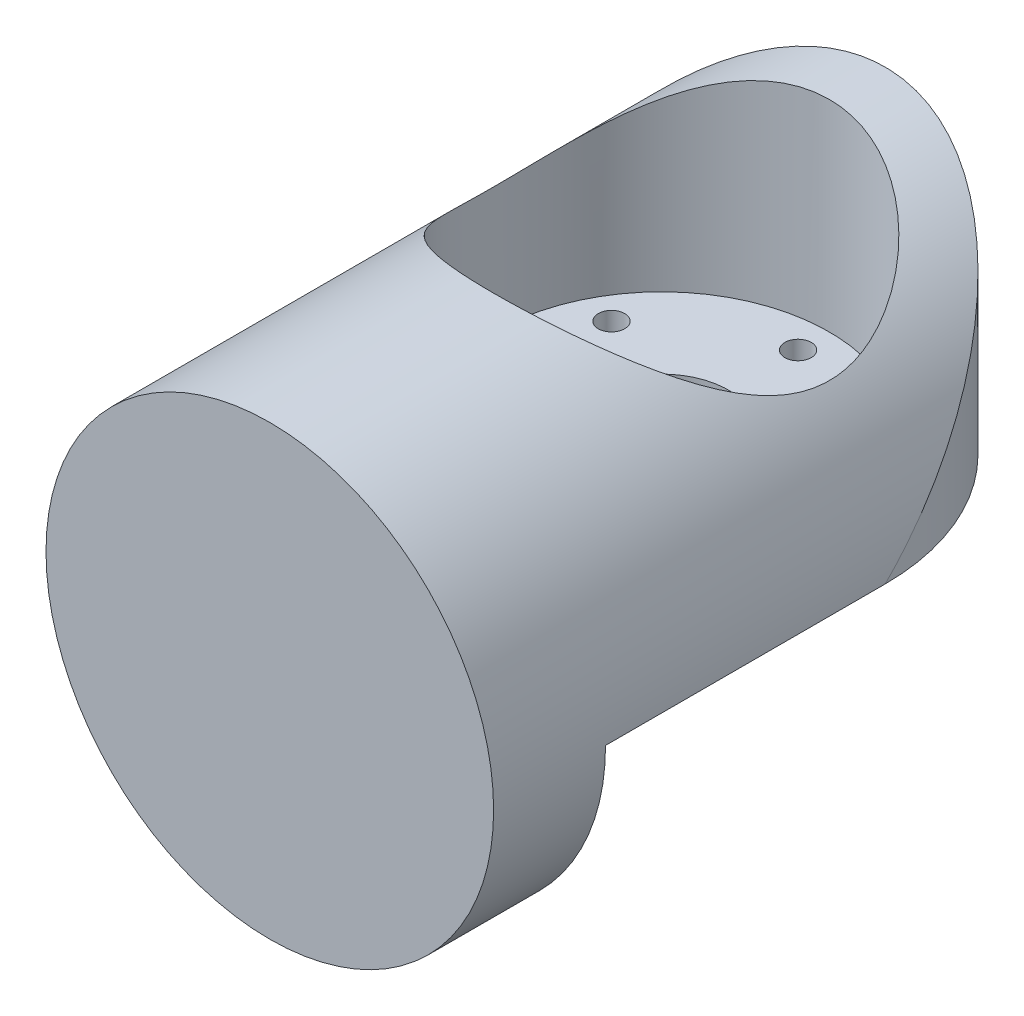
ISO-10303-21;
HEADER;
FILE_DESCRIPTION(('STEP AP214'),'2;1');
FILE_NAME('part.step','',(''),(''),'','','');
FILE_SCHEMA(('AUTOMOTIVE_DESIGN { 1 0 10303 214 1 1 1 1 }'));
ENDSEC;
DATA;
#1=APPLICATION_CONTEXT('core data for automotive mechanical design processes');
#2=APPLICATION_PROTOCOL_DEFINITION('international standard','automotive_design',2000,#1);
#3=PRODUCT_CONTEXT('',#1,'mechanical');
#4=PRODUCT('Part','Part','',(#3));
#5=PRODUCT_RELATED_PRODUCT_CATEGORY('part','',(#4));
#6=PRODUCT_DEFINITION_FORMATION('','',#4);
#7=PRODUCT_DEFINITION_CONTEXT('part definition',#1,'design');
#8=PRODUCT_DEFINITION('design','',#6,#7);
#9=PRODUCT_DEFINITION_SHAPE('','',#8);
#10=(LENGTH_UNIT() NAMED_UNIT(*) SI_UNIT(.MILLI.,.METRE.));
#11=(NAMED_UNIT(*) PLANE_ANGLE_UNIT() SI_UNIT($,.RADIAN.));
#12=(NAMED_UNIT(*) SI_UNIT($,.STERADIAN.) SOLID_ANGLE_UNIT());
#13=UNCERTAINTY_MEASURE_WITH_UNIT(LENGTH_MEASURE(1.E-05),#10,'distance_accuracy_value','');
#14=(GEOMETRIC_REPRESENTATION_CONTEXT(3) GLOBAL_UNCERTAINTY_ASSIGNED_CONTEXT((#13)) GLOBAL_UNIT_ASSIGNED_CONTEXT((#10,
#11,#12)) REPRESENTATION_CONTEXT('',''));
#15=CARTESIAN_POINT('',(0.,0.,0.));
#16=DIRECTION('',(0.,0.,1.));
#17=DIRECTION('',(1.,0.,0.));
#18=AXIS2_PLACEMENT_3D('',#15,#16,#17);
#19=CARTESIAN_POINT('',(0.,25.4,-31.75));
#20=DIRECTION('',(0.,-1.,0.));
#21=DIRECTION('',(0.,0.,-1.));
#22=AXIS2_PLACEMENT_3D('',#19,#20,#21);
#23=CYLINDRICAL_SURFACE('',#22,25.4);
#24=CARTESIAN_POINT('',(0.,0.,-31.75));
#25=DIRECTION('',(0.,-0.707106781186547,-0.707106781186547));
#26=DIRECTION('',(0.,-0.707106781186547,0.707106781186547));
#27=AXIS2_PLACEMENT_3D('',#24,#25,#26);
#28=ELLIPSE('',#27,35.9210244842766,25.4);
#29=CARTESIAN_POINT('',(25.4,0.,-31.75));
#30=VERTEX_POINT('',#29);
#31=CARTESIAN_POINT('',(-25.4,0.,-31.75));
#32=VERTEX_POINT('',#31);
#33=EDGE_CURVE('E96',#30,#32,#28,.F.);
#34=ORIENTED_EDGE('',*,*,#33,.F.);
#35=CARTESIAN_POINT('',(0.,0.,-31.75));
#36=DIRECTION('',(0.,1.,0.));
#37=DIRECTION('',(0.,0.,1.));
#38=AXIS2_PLACEMENT_3D('',#35,#36,#37);
#39=CIRCLE('',#38,25.4);
#40=EDGE_CURVE('E103',#30,#32,#39,.T.);
#41=ORIENTED_EDGE('',*,*,#40,.T.);
#42=EDGE_LOOP('',(#34,#41));
#43=FACE_BOUND('',#42,.T.);
#44=ADVANCED_FACE('F73',(#43),#23,.T.);
#45=CARTESIAN_POINT('',(0.,-53.8815367264149,-31.75));
#46=DIRECTION('',(0.,1.,0.));
#47=DIRECTION('',(0.,0.,1.));
#48=AXIS2_PLACEMENT_3D('',#45,#46,#47);
#49=CYLINDRICAL_SURFACE('',#48,19.05);
#50=CARTESIAN_POINT('',(0.,2.54,-31.75));
#51=DIRECTION('',(0.,1.,0.));
#52=DIRECTION('',(0.,0.,1.));
#53=AXIS2_PLACEMENT_3D('',#50,#51,#52);
#54=CIRCLE('',#53,19.05);
#55=CARTESIAN_POINT('',(0.,2.54,-12.7));
#56=VERTEX_POINT('',#55);
#57=EDGE_CURVE('E104',#56,#56,#54,.T.);
#58=ORIENTED_EDGE('',*,*,#57,.F.);
#59=EDGE_LOOP('',(#58));
#60=FACE_BOUND('',#59,.T.);
#61=CARTESIAN_POINT('',(0.,25.4,-50.8));
#62=CARTESIAN_POINT('',(-0.465674960815866,25.3999963833165,-50.7999962148051));
#63=CARTESIAN_POINT('',(-0.931414983833283,25.3871642978131,-50.7828960688114));
#64=CARTESIAN_POINT('',(-1.85904817792387,25.3361372053949,-50.7147790624438));
#65=CARTESIAN_POINT('',(-2.32094060418442,25.297937398281,-50.6637557829737));
#66=CARTESIAN_POINT('',(-3.23752475206199,25.1970471351016,-50.5285970624894));
#67=CARTESIAN_POINT('',(-3.6922101154738,25.1343361837591,-50.4444339107497));
#68=CARTESIAN_POINT('',(-4.59063842897279,24.9858635363918,-50.2443334792571));
#69=CARTESIAN_POINT('',(-5.0343817163395,24.9001025518355,-50.1283971802205));
#70=CARTESIAN_POINT('',(-5.90568244828982,24.7079109330935,-49.8671505237056));
#71=CARTESIAN_POINT('',(-6.33331628615475,24.6015980996388,-49.7220073909058));
#72=CARTESIAN_POINT('',(-7.17273695881707,24.3700929651458,-49.4037771723099));
#73=CARTESIAN_POINT('',(-7.58452370813733,24.2449005622916,-49.2306899358133));
#74=CARTESIAN_POINT('',(-8.39044101768357,23.9779208195937,-48.8584774726785));
#75=CARTESIAN_POINT('',(-8.78457437975126,23.8361361261782,-48.6593563977789));
#76=CARTESIAN_POINT('',(-9.55401220058095,23.5382899099122,-48.2368446174441));
#77=CARTESIAN_POINT('',(-9.92931390736304,23.3822263097558,-48.0134503798416));
#78=CARTESIAN_POINT('',(-10.6938706856181,23.04325825402,-47.5224024561988));
#79=CARTESIAN_POINT('',(-11.0812143804871,22.8592060087562,-47.2525666762131));
#80=CARTESIAN_POINT('',(-11.8314493110386,22.4800688262363,-46.6878643746782));
#81=CARTESIAN_POINT('',(-12.1943392844704,22.2849833204206,-46.3929965627996));
#82=CARTESIAN_POINT('',(-12.8955697270762,21.8866870812892,-45.77940247007));
#83=CARTESIAN_POINT('',(-13.2338768620604,21.6834658741569,-45.460644941579));
#84=CARTESIAN_POINT('',(-13.884990514142,21.2724072078827,-44.8008391771931));
#85=CARTESIAN_POINT('',(-14.1977950143187,21.0645693852786,-44.4597891820951));
#86=CARTESIAN_POINT('',(-14.8584856315142,20.6053001518655,-43.684711297194));
#87=CARTESIAN_POINT('',(-15.2005719155807,20.3535978137022,-43.2458786067128));
#88=CARTESIAN_POINT('',(-15.8463325144244,19.8549799455356,-42.3380459857917));
#89=CARTESIAN_POINT('',(-16.1499952483675,19.6080658776109,-41.8690370241889));
#90=CARTESIAN_POINT('',(-16.7171388106315,19.1268214872942,-40.9017050283218));
#91=CARTESIAN_POINT('',(-16.9806593110902,18.8924788910393,-40.4034116196049));
#92=CARTESIAN_POINT('',(-17.3441892409843,18.5571109501454,-39.6342834390336));
#93=CARTESIAN_POINT('',(-17.4600545051695,18.4480324020434,-39.3743457053458));
#94=CARTESIAN_POINT('',(-17.6809070360257,18.2364714374993,-38.8471631156588));
#95=CARTESIAN_POINT('',(-17.7858918995299,18.1339904801603,-38.5799166617783));
#96=CARTESIAN_POINT('',(-18.0155350401361,17.9062611544944,-37.9537296342902));
#97=CARTESIAN_POINT('',(-18.1360990401934,17.7838967026555,-37.5922161985175));
#98=CARTESIAN_POINT('',(-18.3564835255813,17.5563270894,-36.8577343817571));
#99=CARTESIAN_POINT('',(-18.4563106667672,17.4511164245169,-36.4847697204922));
#100=CARTESIAN_POINT('',(-18.6338176068266,17.2614516829056,-35.7291493381238));
#101=CARTESIAN_POINT('',(-18.711538896713,17.1769587622157,-35.3465132598471));
#102=CARTESIAN_POINT('',(-18.843794602838,17.0317671094067,-34.5727488269731));
#103=CARTESIAN_POINT('',(-18.8983293064548,16.9710680823832,-34.1816205776923));
#104=CARTESIAN_POINT('',(-18.9834999575328,16.87574879586,-33.3898685915244));
#105=CARTESIAN_POINT('',(-19.0139111337357,16.841373911893,-32.9891905748165));
#106=CARTESIAN_POINT('',(-19.0492755928351,16.8013640298539,-32.1852694036412));
#107=CARTESIAN_POINT('',(-19.0542295742293,16.7957282432349,-31.7820263198583));
#108=CARTESIAN_POINT('',(-19.0385558913474,16.8134921503702,-30.97655915437));
#109=CARTESIAN_POINT('',(-19.017919811497,16.8369013959053,-30.5743354514972));
#110=CARTESIAN_POINT('',(-18.9515525868367,16.9115676948954,-29.7746066635626));
#111=CARTESIAN_POINT('',(-18.9058211863197,16.9628250321065,-29.3771016266233));
#112=CARTESIAN_POINT('',(-18.7964749746221,17.0838630153476,-28.6321173006633));
#113=CARTESIAN_POINT('',(-18.7353078217018,17.151063572039,-28.283849707037));
#114=CARTESIAN_POINT('',(-18.594676413,17.3034321734528,-27.5949773444654));
#115=CARTESIAN_POINT('',(-18.5152056195415,17.3886066371657,-27.254375361346));
#116=CARTESIAN_POINT('',(-18.250669163991,17.6674446941701,-26.245572356386));
#117=CARTESIAN_POINT('',(-18.0394890022204,17.8844118499967,-25.590437743444));
#118=CARTESIAN_POINT('',(-17.6000880671589,18.3159274737197,-24.4393605254907));
#119=CARTESIAN_POINT('',(-17.3824045203658,18.5233690864168,-23.9365279722459));
#120=CARTESIAN_POINT('',(-16.9083380785293,18.9570921178249,-22.957600419194));
#121=CARTESIAN_POINT('',(-16.6519353298344,19.1833831749268,-22.4815193092888));
#122=CARTESIAN_POINT('',(-16.1018972063657,19.6473579322635,-21.5557867396806));
#123=CARTESIAN_POINT('',(-15.8081859085802,19.8850642312209,-21.1061919901628));
#124=CARTESIAN_POINT('',(-15.1852463711559,20.364745154178,-20.2349010974896));
#125=CARTESIAN_POINT('',(-14.8560237296989,20.6067191003886,-19.8132005738124));
#126=CARTESIAN_POINT('',(-14.1541093904084,21.0952267701244,-18.9881687715716));
#127=CARTESIAN_POINT('',(-13.7805320074773,21.341721925792,-18.5855672139986));
#128=CARTESIAN_POINT('',(-12.9975370296717,21.8274223635072,-17.8119417815134));
#129=CARTESIAN_POINT('',(-12.5881156907222,22.0666268804856,-17.440921213391));
#130=CARTESIAN_POINT('',(-11.7347724683084,22.5319954361831,-16.7332009173351));
#131=CARTESIAN_POINT('',(-11.2909046080997,22.7581789629085,-16.3964492881146));
#132=CARTESIAN_POINT('',(-10.5999314019198,23.0838980302636,-15.9189440385571));
#133=CARTESIAN_POINT('',(-10.3654288824766,23.1902047865581,-15.7643890724049));
#134=CARTESIAN_POINT('',(-9.88811116426323,23.3977133422412,-15.4648173894617));
#135=CARTESIAN_POINT('',(-9.64529387757982,23.4989138433871,-15.3198030955243));
#136=CARTESIAN_POINT('',(-9.00374545193631,23.7544310645624,-14.9559257845921));
#137=CARTESIAN_POINT('',(-8.59874175861883,23.9042551949294,-14.7448562571597));
#138=CARTESIAN_POINT('',(-7.76969197563247,24.1864338945188,-14.3504292824567));
#139=CARTESIAN_POINT('',(-7.34564966445566,24.3187919097865,-14.167066367663));
#140=CARTESIAN_POINT('',(-6.48081198198039,24.5634027901583,-13.8302723419074));
#141=CARTESIAN_POINT('',(-6.04003749621509,24.6756797814644,-13.6768052927218));
#142=CARTESIAN_POINT('',(-5.14373741787417,24.8779596280749,-13.4015915201014));
#143=CARTESIAN_POINT('',(-4.68821495997001,24.967967182039,-13.2798381050763));
#144=CARTESIAN_POINT('',(-3.88360140979714,25.1037635942629,-13.0967384779387));
#145=CARTESIAN_POINT('',(-3.53710414759006,25.1549738918815,-13.0279070590665));
#146=CARTESIAN_POINT('',(-2.83898508322272,25.2432947897861,-12.9094055222721));
#147=CARTESIAN_POINT('',(-2.48736245901681,25.2804031018631,-12.8597385139752));
#148=CARTESIAN_POINT('',(-1.78062220829618,25.3399910775699,-12.7800672593716));
#149=CARTESIAN_POINT('',(-1.42550422736553,25.3624692419189,-12.7500650282865));
#150=CARTESIAN_POINT('',(-0.713603327383884,25.3924735603027,-12.7100319899793));
#151=CARTESIAN_POINT('',(-0.356820763685573,25.400002771263,-12.6999970996162));
#152=CARTESIAN_POINT('',(0.465674960815863,25.3999963833165,-12.7000037851949));
#153=CARTESIAN_POINT('',(0.931414983833277,25.3871642978131,-12.7171039311886));
#154=CARTESIAN_POINT('',(1.85904817792387,25.3361372053949,-12.7852209375562));
#155=CARTESIAN_POINT('',(2.32094060418442,25.297937398281,-12.8362442170263));
#156=CARTESIAN_POINT('',(3.23752475206199,25.1970471351016,-12.9714029375106));
#157=CARTESIAN_POINT('',(3.6922101154738,25.1343361837591,-13.0555660892503));
#158=CARTESIAN_POINT('',(4.59063842897279,24.9858635363918,-13.2556665207429));
#159=CARTESIAN_POINT('',(5.03438171633951,24.9001025518355,-13.3716028197795));
#160=CARTESIAN_POINT('',(5.90568244828982,24.7079109330935,-13.6328494762944));
#161=CARTESIAN_POINT('',(6.33331628615475,24.6015980996388,-13.7779926090942));
#162=CARTESIAN_POINT('',(7.17273695881707,24.3700929651458,-14.0962228276901));
#163=CARTESIAN_POINT('',(7.58452370813734,24.2449005622916,-14.2693100641867));
#164=CARTESIAN_POINT('',(8.39044101768357,23.9779208195937,-14.6415225273216));
#165=CARTESIAN_POINT('',(8.78457437975126,23.8361361261782,-14.8406436022211));
#166=CARTESIAN_POINT('',(9.55401220058095,23.5382899099122,-15.2631553825559));
#167=CARTESIAN_POINT('',(9.92931390736304,23.3822263097558,-15.4865496201584));
#168=CARTESIAN_POINT('',(10.6938706856181,23.04325825402,-15.9775975438012));
#169=CARTESIAN_POINT('',(11.0812143804871,22.8592060087562,-16.2474333237869));
#170=CARTESIAN_POINT('',(11.8314493110386,22.4800688262363,-16.8121356253218));
#171=CARTESIAN_POINT('',(12.1943392844704,22.2849833204206,-17.1070034372004));
#172=CARTESIAN_POINT('',(12.8955697270762,21.8866870812892,-17.72059752993));
#173=CARTESIAN_POINT('',(13.2338768620604,21.6834658741569,-18.039355058421));
#174=CARTESIAN_POINT('',(13.884990514142,21.2724072078827,-18.6991608228069));
#175=CARTESIAN_POINT('',(14.1977950143187,21.0645693852786,-19.0402108179049));
#176=CARTESIAN_POINT('',(14.8584856315142,20.6053001518654,-19.815288702806));
#177=CARTESIAN_POINT('',(15.2005719155807,20.3535978137022,-20.2541213932872));
#178=CARTESIAN_POINT('',(15.8463325144244,19.8549799455356,-21.1619540142083));
#179=CARTESIAN_POINT('',(16.1499952483675,19.6080658776109,-21.6309629758111));
#180=CARTESIAN_POINT('',(16.7171388106315,19.1268214872941,-22.5982949716782));
#181=CARTESIAN_POINT('',(16.9806593110902,18.8924788910393,-23.0965883803951));
#182=CARTESIAN_POINT('',(17.3441892409843,18.5571109501454,-23.8657165609664));
#183=CARTESIAN_POINT('',(17.4600545051695,18.4480324020434,-24.1256542946543));
#184=CARTESIAN_POINT('',(17.6809070360257,18.2364714374993,-24.6528368843412));
#185=CARTESIAN_POINT('',(17.7858918995299,18.1339904801603,-24.9200833382217));
#186=CARTESIAN_POINT('',(18.0155350401361,17.9062611544944,-25.5462703657098));
#187=CARTESIAN_POINT('',(18.1360990401934,17.7838967026555,-25.9077838014825));
#188=CARTESIAN_POINT('',(18.3564835255813,17.5563270894,-26.6422656182429));
#189=CARTESIAN_POINT('',(18.4563106667672,17.4511164245169,-27.0152302795078));
#190=CARTESIAN_POINT('',(18.6338176068266,17.2614516829056,-27.7708506618762));
#191=CARTESIAN_POINT('',(18.711538896713,17.1769587622157,-28.1534867401529));
#192=CARTESIAN_POINT('',(18.8437946028381,17.0317671094067,-28.9272511730269));
#193=CARTESIAN_POINT('',(18.8983293064548,16.9710680823832,-29.3183794223077));
#194=CARTESIAN_POINT('',(18.9834999575328,16.87574879586,-30.1101314084757));
#195=CARTESIAN_POINT('',(19.0139111337357,16.841373911893,-30.5108094251835));
#196=CARTESIAN_POINT('',(19.0492755928351,16.8013640298539,-31.3147305963588));
#197=CARTESIAN_POINT('',(19.0542295742293,16.7957282432349,-31.7179736801417));
#198=CARTESIAN_POINT('',(19.0385558913473,16.8134921503702,-32.5234408456301));
#199=CARTESIAN_POINT('',(19.017919811497,16.8369013959053,-32.9256645485028));
#200=CARTESIAN_POINT('',(18.9515525868367,16.9115676948954,-33.7253933364375));
#201=CARTESIAN_POINT('',(18.9058211863197,16.9628250321065,-34.1228983733767));
#202=CARTESIAN_POINT('',(18.7964749746221,17.0838630153476,-34.8678826993367));
#203=CARTESIAN_POINT('',(18.7353078217018,17.151063572039,-35.216150292963));
#204=CARTESIAN_POINT('',(18.594676413,17.3034321734528,-35.9050226555346));
#205=CARTESIAN_POINT('',(18.5152056195415,17.3886066371657,-36.245624638654));
#206=CARTESIAN_POINT('',(18.250669163991,17.6674446941701,-37.254427643614));
#207=CARTESIAN_POINT('',(18.0394890022204,17.8844118499967,-37.909562256556));
#208=CARTESIAN_POINT('',(17.6000880671588,18.3159274737197,-39.0606394745093));
#209=CARTESIAN_POINT('',(17.3824045203658,18.5233690864168,-39.5634720277541));
#210=CARTESIAN_POINT('',(16.9083380785292,18.9570921178249,-40.542399580806));
#211=CARTESIAN_POINT('',(16.6519353298343,19.1833831749268,-41.0184806907113));
#212=CARTESIAN_POINT('',(16.1018972063657,19.6473579322635,-41.9442132603194));
#213=CARTESIAN_POINT('',(15.8081859085802,19.8850642312209,-42.3938080098372));
#214=CARTESIAN_POINT('',(15.1852463711559,20.364745154178,-43.2650989025104));
#215=CARTESIAN_POINT('',(14.8560237296989,20.6067191003886,-43.6867994261876));
#216=CARTESIAN_POINT('',(14.1541093904084,21.0952267701244,-44.5118312284284));
#217=CARTESIAN_POINT('',(13.7805320074773,21.341721925792,-44.9144327860014));
#218=CARTESIAN_POINT('',(12.9975370296717,21.8274223635072,-45.6880582184866));
#219=CARTESIAN_POINT('',(12.5881156907221,22.0666268804857,-46.059078786609));
#220=CARTESIAN_POINT('',(11.7347724683084,22.5319954361831,-46.7667990826649));
#221=CARTESIAN_POINT('',(11.2909046080997,22.7581789629085,-47.1035507118854));
#222=CARTESIAN_POINT('',(10.5999314019197,23.0838980302636,-47.5810559614429));
#223=CARTESIAN_POINT('',(10.3654288824765,23.1902047865581,-47.7356109275951));
#224=CARTESIAN_POINT('',(9.8881111642632,23.3977133422412,-48.0351826105383));
#225=CARTESIAN_POINT('',(9.6452938775798,23.4989138433871,-48.1801969044757));
#226=CARTESIAN_POINT('',(9.00374545193629,23.7544310645624,-48.5440742154079));
#227=CARTESIAN_POINT('',(8.59874175861881,23.9042551949294,-48.7551437428403));
#228=CARTESIAN_POINT('',(7.76969197563244,24.1864338945188,-49.1495707175433));
#229=CARTESIAN_POINT('',(7.34564966445563,24.3187919097865,-49.332933632337));
#230=CARTESIAN_POINT('',(6.48081198198036,24.5634027901583,-49.6697276580926));
#231=CARTESIAN_POINT('',(6.04003749621506,24.6756797814644,-49.8231947072782));
#232=CARTESIAN_POINT('',(5.14373741787414,24.8779596280749,-50.0984084798986));
#233=CARTESIAN_POINT('',(4.68821495996999,24.967967182039,-50.2201618949238));
#234=CARTESIAN_POINT('',(3.88360140979712,25.1037635942629,-50.4032615220613));
#235=CARTESIAN_POINT('',(3.53710414759004,25.1549738918815,-50.4720929409335));
#236=CARTESIAN_POINT('',(2.8389850832227,25.2432947897861,-50.5905944777279));
#237=CARTESIAN_POINT('',(2.48736245901678,25.2804031018631,-50.6402614860248));
#238=CARTESIAN_POINT('',(1.78062220829616,25.3399910775699,-50.7199327406284));
#239=CARTESIAN_POINT('',(1.42550422736552,25.3624692419189,-50.7499349717135));
#240=CARTESIAN_POINT('',(0.713603327383874,25.3924735603027,-50.7899680100207));
#241=CARTESIAN_POINT('',(0.356820763685567,25.400002771263,-50.8000029003838));
#242=CARTESIAN_POINT('',(0.,25.4,-50.8));
#243=B_SPLINE_CURVE_WITH_KNOTS('',3,(#61,#62,#63,#64,#65,#66,#67,#68,#69,#70,#71,#72,#73,#74,
#75,#76,#77,#78,#79,#80,#81,#82,#83,#84,#85,#86,#87,#88,#89,#90,#91,#92,#93,#94,#95,#96,#97,#98,
#99,#100,#101,#102,#103,#104,#105,#106,#107,#108,#109,#110,#111,#112,#113,#114,#115,#116,#117,
#118,#119,#120,#121,#122,#123,#124,#125,#126,#127,#128,#129,#130,#131,#132,#133,#134,#135,#136,
#137,#138,#139,#140,#141,#142,#143,#144,#145,#146,#147,#148,#149,#150,#151,#152,#153,#154,#155,
#156,#157,#158,#159,#160,#161,#162,#163,#164,#165,#166,#167,#168,#169,#170,#171,#172,#173,#174,
#175,#176,#177,#178,#179,#180,#181,#182,#183,#184,#185,#186,#187,#188,#189,#190,#191,#192,#193,
#194,#195,#196,#197,#198,#199,#200,#201,#202,#203,#204,#205,#206,#207,#208,#209,#210,#211,#212,
#213,#214,#215,#216,#217,#218,#219,#220,#221,#222,#223,#224,#225,#226,#227,#228,#229,#230,#231,
#232,#233,#234,#235,#236,#237,#238,#239,#240,#241,#242),.UNSPECIFIED.,.T.,.F.,(4,2,2,2,2,2,2,2,
2,2,2,2,2,2,2,2,2,2,2,2,2,2,2,2,2,2,2,2,2,2,2,2,2,2,2,2,2,2,2,2,2,2,2,2,2,2,2,2,2,2,2,2,2,2,2,2,
2,2,2,2,2,2,2,2,2,2,2,2,2,2,2,2,2,2,2,2,2,2,2,2,2,2,2,2,2,2,2,2,2,2,4),(0.,1.3966518657921,
2.79356808792397,4.19165486515895,5.58969849363422,6.97995436895161,8.37021774207725,
9.76025967318114,11.1505041511404,12.669117635853,14.1878094483167,15.7085235870091,
17.2293578776156,19.0594345285377,20.8900614561841,22.7188672904586,23.6329124252075,
24.5471590178393,25.7469044030545,26.9462641120978,28.1433576302218,29.34043631095,
30.5485419060732,31.7566143528652,32.9650841929969,34.1735663469772,35.2522802330766,
36.3313800123467,38.489773212682,40.2453145941691,42.0017592226745,43.76183727022,
45.5216382548711,47.3257426569494,49.1300357318432,50.9315541594611,51.832188585897,
52.7330508525827,54.1735079782132,55.6136804769518,57.052110894295,58.4902375558893,
59.5603497054733,60.630635418966,61.7010307968546,62.7712072660418,64.1678591318339,
65.5647753539658,66.9628621312008,68.360905759676,69.7511616349934,71.1414250081191,
72.531466939223,73.9217114171823,75.4403249018948,76.9590167143586,78.4797308530509,
80.0005651436574,81.8306417945795,83.661268722226,85.4900745565005,86.4041196912493,
87.3183662838811,88.5181116690963,89.7174713781396,90.9145648962637,92.1116435769919,
93.319749172115,94.5278216189071,95.7362914590387,96.944773613019,98.0234874991185,
99.1025872783886,101.260980478724,103.016521860211,104.772966488716,106.533044536262,
108.292845520913,110.096949922991,111.901242997885,113.702761425503,114.603395851939,
115.504258118625,116.944715244255,118.384887742994,119.823318160337,121.261444821931,
122.331556971515,123.401842685008,124.472238062896,125.542414532084),.UNSPECIFIED.);
#244=CARTESIAN_POINT('',(0.,25.4,-50.8));
#245=VERTEX_POINT('',#244);
#246=EDGE_CURVE('E13',#245,#245,#243,.T.);
#247=ORIENTED_EDGE('',*,*,#246,.T.);
#248=EDGE_LOOP('',(#247));
#249=FACE_BOUND('',#248,.T.);
#250=ADVANCED_FACE('F125',(#60,#249),#49,.F.);
#251=CARTESIAN_POINT('',(0.,0.,12.7));
#252=DIRECTION('',(0.,0.,-1.));
#253=DIRECTION('',(-1.,0.,0.));
#254=AXIS2_PLACEMENT_3D('',#251,#252,#253);
#255=CYLINDRICAL_SURFACE('',#254,25.4);
#256=ORIENTED_EDGE('',*,*,#246,.F.);
#257=EDGE_LOOP('',(#256));
#258=FACE_BOUND('',#257,.T.);
#259=CARTESIAN_POINT('',(0.,0.,12.7));
#260=DIRECTION('',(0.,0.,1.));
#261=DIRECTION('',(1.,0.,0.));
#262=AXIS2_PLACEMENT_3D('',#259,#260,#261);
#263=CIRCLE('',#262,25.4);
#264=CARTESIAN_POINT('',(25.4,0.,12.7));
#265=VERTEX_POINT('',#264);
#266=EDGE_CURVE('E82',#265,#265,#263,.T.);
#267=ORIENTED_EDGE('',*,*,#266,.F.);
#268=EDGE_LOOP('',(#267));
#269=FACE_BOUND('',#268,.T.);
#270=CARTESIAN_POINT('',(0.,0.,0.));
#271=DIRECTION('',(0.,0.,1.));
#272=DIRECTION('',(1.,0.,0.));
#273=AXIS2_PLACEMENT_3D('',#270,#271,#272);
#274=CIRCLE('',#273,25.4);
#275=CARTESIAN_POINT('',(-25.4,0.,0.));
#276=VERTEX_POINT('',#275);
#277=CARTESIAN_POINT('',(25.4,0.,0.));
#278=VERTEX_POINT('',#277);
#279=EDGE_CURVE('E108',#276,#278,#274,.T.);
#280=ORIENTED_EDGE('',*,*,#279,.T.);
#281=DIRECTION('',(0.,0.,-1.));
#282=VECTOR('',#281,1.);
#283=CARTESIAN_POINT('',(25.4,0.,0.));
#284=LINE('',#283,#282);
#285=EDGE_CURVE('E89',#278,#30,#284,.T.);
#286=ORIENTED_EDGE('',*,*,#285,.T.);
#287=ORIENTED_EDGE('',*,*,#33,.T.);
#288=DIRECTION('',(0.,0.,-1.));
#289=VECTOR('',#288,1.);
#290=CARTESIAN_POINT('',(-25.4,0.,0.));
#291=LINE('',#290,#289);
#292=EDGE_CURVE('E112',#276,#32,#291,.T.);
#293=ORIENTED_EDGE('',*,*,#292,.F.);
#294=EDGE_LOOP('',(#280,#286,#287,#293));
#295=FACE_BOUND('',#294,.T.);
#296=ADVANCED_FACE('F75',(#258,#269,#295),#255,.T.);
#297=CARTESIAN_POINT('',(0.,0.,12.7));
#298=DIRECTION('',(0.,0.,1.));
#299=DIRECTION('',(1.,0.,0.));
#300=AXIS2_PLACEMENT_3D('',#297,#298,#299);
#301=PLANE('',#300);
#302=ORIENTED_EDGE('',*,*,#266,.T.);
#303=EDGE_LOOP('',(#302));
#304=FACE_BOUND('',#303,.T.);
#305=ADVANCED_FACE('F156',(#304),#301,.T.);
#306=CARTESIAN_POINT('',(0.,0.,0.));
#307=DIRECTION('',(0.,0.,1.));
#308=DIRECTION('',(1.,0.,0.));
#309=AXIS2_PLACEMENT_3D('',#306,#307,#308);
#310=PLANE('',#309);
#311=ORIENTED_EDGE('',*,*,#279,.F.);
#312=DIRECTION('',(1.,0.,0.));
#313=VECTOR('',#312,1.);
#314=CARTESIAN_POINT('',(-25.4,0.,0.));
#315=LINE('',#314,#313);
#316=EDGE_CURVE('E109',#276,#278,#315,.T.);
#317=ORIENTED_EDGE('',*,*,#316,.T.);
#318=EDGE_LOOP('',(#311,#317));
#319=FACE_BOUND('',#318,.T.);
#320=ADVANCED_FACE('F144',(#319),#310,.F.);
#321=CARTESIAN_POINT('',(0.,0.,-31.75));
#322=DIRECTION('',(0.,1.,0.));
#323=DIRECTION('',(0.,0.,1.));
#324=AXIS2_PLACEMENT_3D('',#321,#322,#323);
#325=PLANE('',#324);
#326=CARTESIAN_POINT('',(-13.4233937482665,0.,-39.499999994));
#327=DIRECTION('',(0.,1.,0.));
#328=DIRECTION('',(0.,0.,1.));
#329=AXIS2_PLACEMENT_3D('',#326,#327,#328);
#330=CIRCLE('',#329,1.5);
#331=CARTESIAN_POINT('',(-13.4233937482665,0.,-37.999999994));
#332=VERTEX_POINT('',#331);
#333=EDGE_CURVE('E269',#332,#332,#330,.T.);
#334=ORIENTED_EDGE('',*,*,#333,.T.);
#335=EDGE_LOOP('',(#334));
#336=FACE_BOUND('',#335,.T.);
#337=CARTESIAN_POINT('',(-13.4233937482665,0.,-24.000000006));
#338=DIRECTION('',(0.,1.,0.));
#339=DIRECTION('',(0.,0.,1.));
#340=AXIS2_PLACEMENT_3D('',#337,#338,#339);
#341=CIRCLE('',#340,1.5);
#342=CARTESIAN_POINT('',(-13.4233937482665,0.,-22.500000006));
#343=VERTEX_POINT('',#342);
#344=EDGE_CURVE('E271',#343,#343,#341,.T.);
#345=ORIENTED_EDGE('',*,*,#344,.T.);
#346=EDGE_LOOP('',(#345));
#347=FACE_BOUND('',#346,.T.);
#348=CARTESIAN_POINT('',(0.,0.,-16.250000012));
#349=DIRECTION('',(0.,1.,0.));
#350=DIRECTION('',(0.,0.,1.));
#351=AXIS2_PLACEMENT_3D('',#348,#349,#350);
#352=CIRCLE('',#351,1.5);
#353=CARTESIAN_POINT('',(0.,0.,-14.750000012));
#354=VERTEX_POINT('',#353);
#355=EDGE_CURVE('E275',#354,#354,#352,.T.);
#356=ORIENTED_EDGE('',*,*,#355,.T.);
#357=EDGE_LOOP('',(#356));
#358=FACE_BOUND('',#357,.T.);
#359=CARTESIAN_POINT('',(13.4233937482665,0.,-24.000000006));
#360=DIRECTION('',(0.,1.,0.));
#361=DIRECTION('',(0.,0.,1.));
#362=AXIS2_PLACEMENT_3D('',#359,#360,#361);
#363=CIRCLE('',#362,1.5);
#364=CARTESIAN_POINT('',(13.4233937482665,0.,-22.500000006));
#365=VERTEX_POINT('',#364);
#366=EDGE_CURVE('E280',#365,#365,#363,.T.);
#367=ORIENTED_EDGE('',*,*,#366,.T.);
#368=EDGE_LOOP('',(#367));
#369=FACE_BOUND('',#368,.T.);
#370=CARTESIAN_POINT('',(13.4233937482665,0.,-39.499999994));
#371=DIRECTION('',(0.,1.,0.));
#372=DIRECTION('',(0.,0.,1.));
#373=AXIS2_PLACEMENT_3D('',#370,#371,#372);
#374=CIRCLE('',#373,1.5);
#375=CARTESIAN_POINT('',(13.4233937482665,0.,-37.999999994));
#376=VERTEX_POINT('',#375);
#377=EDGE_CURVE('E283',#376,#376,#374,.T.);
#378=ORIENTED_EDGE('',*,*,#377,.T.);
#379=EDGE_LOOP('',(#378));
#380=FACE_BOUND('',#379,.T.);
#381=CARTESIAN_POINT('',(0.,0.,-47.249999988));
#382=DIRECTION('',(0.,1.,0.));
#383=DIRECTION('',(0.,0.,1.));
#384=AXIS2_PLACEMENT_3D('',#381,#382,#383);
#385=CIRCLE('',#384,1.5);
#386=CARTESIAN_POINT('',(0.,0.,-45.749999988));
#387=VERTEX_POINT('',#386);
#388=EDGE_CURVE('E286',#387,#387,#385,.T.);
#389=ORIENTED_EDGE('',*,*,#388,.T.);
#390=EDGE_LOOP('',(#389));
#391=FACE_BOUND('',#390,.T.);
#392=CARTESIAN_POINT('',(0.,0.,-31.75));
#393=DIRECTION('',(0.,1.,0.));
#394=DIRECTION('',(0.,0.,1.));
#395=AXIS2_PLACEMENT_3D('',#392,#393,#394);
#396=CIRCLE('',#395,7.62);
#397=CARTESIAN_POINT('',(0.,0.,-24.13));
#398=VERTEX_POINT('',#397);
#399=EDGE_CURVE('E77',#398,#398,#396,.T.);
#400=ORIENTED_EDGE('',*,*,#399,.T.);
#401=EDGE_LOOP('',(#400));
#402=FACE_BOUND('',#401,.T.);
#403=ORIENTED_EDGE('',*,*,#40,.F.);
#404=ORIENTED_EDGE('',*,*,#285,.F.);
#405=ORIENTED_EDGE('',*,*,#316,.F.);
#406=ORIENTED_EDGE('',*,*,#292,.T.);
#407=EDGE_LOOP('',(#403,#404,#405,#406));
#408=FACE_BOUND('',#407,.T.);
#409=ADVANCED_FACE('F111',(#336,#347,#358,#369,#380,#391,#402,#408),#325,.F.);
#410=CARTESIAN_POINT('',(0.,2.54,-31.75));
#411=DIRECTION('',(0.,1.,0.));
#412=DIRECTION('',(0.,0.,1.));
#413=AXIS2_PLACEMENT_3D('',#410,#411,#412);
#414=PLANE('',#413);
#415=CARTESIAN_POINT('',(0.,2.54,-31.75));
#416=DIRECTION('',(0.,1.,0.));
#417=DIRECTION('',(0.,0.,1.));
#418=AXIS2_PLACEMENT_3D('',#415,#416,#417);
#419=CIRCLE('',#418,7.62);
#420=CARTESIAN_POINT('',(0.,2.54,-24.13));
#421=VERTEX_POINT('',#420);
#422=EDGE_CURVE('E265',#421,#421,#419,.T.);
#423=ORIENTED_EDGE('',*,*,#422,.F.);
#424=EDGE_LOOP('',(#423));
#425=FACE_BOUND('',#424,.T.);
#426=CARTESIAN_POINT('',(-13.4233937482665,2.54,-39.499999994));
#427=DIRECTION('',(0.,1.,0.));
#428=DIRECTION('',(0.,0.,1.));
#429=AXIS2_PLACEMENT_3D('',#426,#427,#428);
#430=CIRCLE('',#429,1.5);
#431=CARTESIAN_POINT('',(-13.4233937482665,2.54,-37.999999994));
#432=VERTEX_POINT('',#431);
#433=EDGE_CURVE('E291',#432,#432,#430,.T.);
#434=ORIENTED_EDGE('',*,*,#433,.F.);
#435=EDGE_LOOP('',(#434));
#436=FACE_BOUND('',#435,.T.);
#437=CARTESIAN_POINT('',(-13.4233937482665,2.54,-24.000000006));
#438=DIRECTION('',(0.,1.,0.));
#439=DIRECTION('',(0.,0.,1.));
#440=AXIS2_PLACEMENT_3D('',#437,#438,#439);
#441=CIRCLE('',#440,1.5);
#442=CARTESIAN_POINT('',(-13.4233937482665,2.54,-22.500000006));
#443=VERTEX_POINT('',#442);
#444=EDGE_CURVE('E294',#443,#443,#441,.T.);
#445=ORIENTED_EDGE('',*,*,#444,.F.);
#446=EDGE_LOOP('',(#445));
#447=FACE_BOUND('',#446,.T.);
#448=CARTESIAN_POINT('',(0.,2.54,-16.250000012));
#449=DIRECTION('',(0.,1.,0.));
#450=DIRECTION('',(0.,0.,1.));
#451=AXIS2_PLACEMENT_3D('',#448,#449,#450);
#452=CIRCLE('',#451,1.5);
#453=CARTESIAN_POINT('',(0.,2.54,-14.750000012));
#454=VERTEX_POINT('',#453);
#455=EDGE_CURVE('E297',#454,#454,#452,.T.);
#456=ORIENTED_EDGE('',*,*,#455,.F.);
#457=EDGE_LOOP('',(#456));
#458=FACE_BOUND('',#457,.T.);
#459=CARTESIAN_POINT('',(13.4233937482665,2.54,-24.000000006));
#460=DIRECTION('',(0.,1.,0.));
#461=DIRECTION('',(0.,0.,1.));
#462=AXIS2_PLACEMENT_3D('',#459,#460,#461);
#463=CIRCLE('',#462,1.5);
#464=CARTESIAN_POINT('',(13.4233937482665,2.54,-22.500000006));
#465=VERTEX_POINT('',#464);
#466=EDGE_CURVE('E300',#465,#465,#463,.T.);
#467=ORIENTED_EDGE('',*,*,#466,.F.);
#468=EDGE_LOOP('',(#467));
#469=FACE_BOUND('',#468,.T.);
#470=CARTESIAN_POINT('',(13.4233937482665,2.54,-39.499999994));
#471=DIRECTION('',(0.,1.,0.));
#472=DIRECTION('',(0.,0.,1.));
#473=AXIS2_PLACEMENT_3D('',#470,#471,#472);
#474=CIRCLE('',#473,1.5);
#475=CARTESIAN_POINT('',(13.4233937482665,2.54,-37.999999994));
#476=VERTEX_POINT('',#475);
#477=EDGE_CURVE('E303',#476,#476,#474,.T.);
#478=ORIENTED_EDGE('',*,*,#477,.F.);
#479=EDGE_LOOP('',(#478));
#480=FACE_BOUND('',#479,.T.);
#481=CARTESIAN_POINT('',(0.,2.54,-47.249999988));
#482=DIRECTION('',(0.,1.,0.));
#483=DIRECTION('',(0.,0.,1.));
#484=AXIS2_PLACEMENT_3D('',#481,#482,#483);
#485=CIRCLE('',#484,1.5);
#486=CARTESIAN_POINT('',(0.,2.54,-45.749999988));
#487=VERTEX_POINT('',#486);
#488=EDGE_CURVE('E290',#487,#487,#485,.T.);
#489=ORIENTED_EDGE('',*,*,#488,.F.);
#490=EDGE_LOOP('',(#489));
#491=FACE_BOUND('',#490,.T.);
#492=ORIENTED_EDGE('',*,*,#57,.T.);
#493=EDGE_LOOP('',(#492));
#494=FACE_BOUND('',#493,.T.);
#495=ADVANCED_FACE('F133',(#425,#436,#447,#458,#469,#480,#491,#494),#414,.T.);
#496=CARTESIAN_POINT('',(0.,-25.4,-47.249999988));
#497=DIRECTION('',(0.,1.,0.));
#498=DIRECTION('',(0.,0.,1.));
#499=AXIS2_PLACEMENT_3D('',#496,#497,#498);
#500=CYLINDRICAL_SURFACE('',#499,1.5);
#501=ORIENTED_EDGE('',*,*,#488,.T.);
#502=EDGE_LOOP('',(#501));
#503=FACE_BOUND('',#502,.T.);
#504=ORIENTED_EDGE('',*,*,#388,.F.);
#505=EDGE_LOOP('',(#504));
#506=FACE_BOUND('',#505,.T.);
#507=ADVANCED_FACE('F135',(#503,#506),#500,.F.);
#508=CARTESIAN_POINT('',(13.4233937482665,-25.4,-39.499999994));
#509=DIRECTION('',(0.,1.,0.));
#510=DIRECTION('',(0.,0.,1.));
#511=AXIS2_PLACEMENT_3D('',#508,#509,#510);
#512=CYLINDRICAL_SURFACE('',#511,1.5);
#513=ORIENTED_EDGE('',*,*,#477,.T.);
#514=EDGE_LOOP('',(#513));
#515=FACE_BOUND('',#514,.T.);
#516=ORIENTED_EDGE('',*,*,#377,.F.);
#517=EDGE_LOOP('',(#516));
#518=FACE_BOUND('',#517,.T.);
#519=ADVANCED_FACE('F141',(#515,#518),#512,.F.);
#520=CARTESIAN_POINT('',(13.4233937482665,-25.4,-24.000000006));
#521=DIRECTION('',(0.,1.,0.));
#522=DIRECTION('',(0.,0.,1.));
#523=AXIS2_PLACEMENT_3D('',#520,#521,#522);
#524=CYLINDRICAL_SURFACE('',#523,1.5);
#525=ORIENTED_EDGE('',*,*,#466,.T.);
#526=EDGE_LOOP('',(#525));
#527=FACE_BOUND('',#526,.T.);
#528=ORIENTED_EDGE('',*,*,#366,.F.);
#529=EDGE_LOOP('',(#528));
#530=FACE_BOUND('',#529,.T.);
#531=ADVANCED_FACE('F213',(#527,#530),#524,.F.);
#532=CARTESIAN_POINT('',(0.,-25.4,-16.250000012));
#533=DIRECTION('',(0.,1.,0.));
#534=DIRECTION('',(0.,0.,1.));
#535=AXIS2_PLACEMENT_3D('',#532,#533,#534);
#536=CYLINDRICAL_SURFACE('',#535,1.5);
#537=ORIENTED_EDGE('',*,*,#455,.T.);
#538=EDGE_LOOP('',(#537));
#539=FACE_BOUND('',#538,.T.);
#540=ORIENTED_EDGE('',*,*,#355,.F.);
#541=EDGE_LOOP('',(#540));
#542=FACE_BOUND('',#541,.T.);
#543=ADVANCED_FACE('F223',(#539,#542),#536,.F.);
#544=CARTESIAN_POINT('',(-13.4233937482665,-25.4,-24.000000006));
#545=DIRECTION('',(0.,1.,0.));
#546=DIRECTION('',(0.,0.,1.));
#547=AXIS2_PLACEMENT_3D('',#544,#545,#546);
#548=CYLINDRICAL_SURFACE('',#547,1.5);
#549=ORIENTED_EDGE('',*,*,#444,.T.);
#550=EDGE_LOOP('',(#549));
#551=FACE_BOUND('',#550,.T.);
#552=ORIENTED_EDGE('',*,*,#344,.F.);
#553=EDGE_LOOP('',(#552));
#554=FACE_BOUND('',#553,.T.);
#555=ADVANCED_FACE('F233',(#551,#554),#548,.F.);
#556=CARTESIAN_POINT('',(-13.4233937482665,-25.4,-39.499999994));
#557=DIRECTION('',(0.,1.,0.));
#558=DIRECTION('',(0.,0.,1.));
#559=AXIS2_PLACEMENT_3D('',#556,#557,#558);
#560=CYLINDRICAL_SURFACE('',#559,1.5);
#561=ORIENTED_EDGE('',*,*,#433,.T.);
#562=EDGE_LOOP('',(#561));
#563=FACE_BOUND('',#562,.T.);
#564=ORIENTED_EDGE('',*,*,#333,.F.);
#565=EDGE_LOOP('',(#564));
#566=FACE_BOUND('',#565,.T.);
#567=ADVANCED_FACE('F243',(#563,#566),#560,.F.);
#568=CARTESIAN_POINT('',(0.,-25.4,-31.75));
#569=DIRECTION('',(0.,1.,0.));
#570=DIRECTION('',(0.,0.,1.));
#571=AXIS2_PLACEMENT_3D('',#568,#569,#570);
#572=CYLINDRICAL_SURFACE('',#571,7.62);
#573=ORIENTED_EDGE('',*,*,#422,.T.);
#574=EDGE_LOOP('',(#573));
#575=FACE_BOUND('',#574,.T.);
#576=ORIENTED_EDGE('',*,*,#399,.F.);
#577=EDGE_LOOP('',(#576));
#578=FACE_BOUND('',#577,.T.);
#579=ADVANCED_FACE('F131',(#575,#578),#572,.F.);
#580=CLOSED_SHELL('',(#44,#250,#296,#305,#320,#409,#495,#507,#519,#531,#543,#555,#567,#579));
#581=MANIFOLD_SOLID_BREP('B2',#580);
#582=ADVANCED_BREP_SHAPE_REPRESENTATION('',(#18,#581),#14);
#583=SHAPE_DEFINITION_REPRESENTATION(#9,#582);
ENDSEC;
END-ISO-10303-21;
